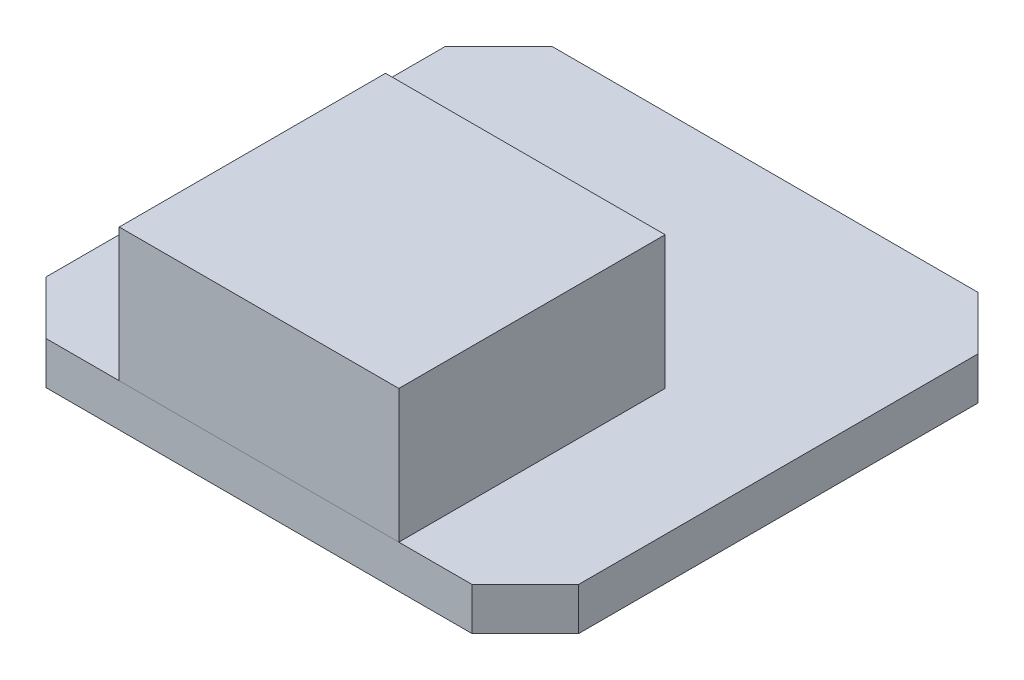
ISO-10303-21;
HEADER;
FILE_DESCRIPTION(('STEP AP214'),'2;1');
FILE_NAME('part.step','',(''),(''),'','','');
FILE_SCHEMA(('AUTOMOTIVE_DESIGN { 1 0 10303 214 1 1 1 1 }'));
ENDSEC;
DATA;
#1=APPLICATION_CONTEXT('core data for automotive mechanical design processes');
#2=APPLICATION_PROTOCOL_DEFINITION('international standard','automotive_design',2000,#1);
#3=PRODUCT_CONTEXT('',#1,'mechanical');
#4=PRODUCT('Part','Part','',(#3));
#5=PRODUCT_RELATED_PRODUCT_CATEGORY('part','',(#4));
#6=PRODUCT_DEFINITION_FORMATION('','',#4);
#7=PRODUCT_DEFINITION_CONTEXT('part definition',#1,'design');
#8=PRODUCT_DEFINITION('design','',#6,#7);
#9=PRODUCT_DEFINITION_SHAPE('','',#8);
#10=(LENGTH_UNIT() NAMED_UNIT(*) SI_UNIT(.MILLI.,.METRE.));
#11=(NAMED_UNIT(*) PLANE_ANGLE_UNIT() SI_UNIT($,.RADIAN.));
#12=(NAMED_UNIT(*) SI_UNIT($,.STERADIAN.) SOLID_ANGLE_UNIT());
#13=UNCERTAINTY_MEASURE_WITH_UNIT(LENGTH_MEASURE(1.E-05),#10,'distance_accuracy_value','');
#14=(GEOMETRIC_REPRESENTATION_CONTEXT(3) GLOBAL_UNCERTAINTY_ASSIGNED_CONTEXT((#13)) GLOBAL_UNIT_ASSIGNED_CONTEXT((#10,
#11,#12)) REPRESENTATION_CONTEXT('',''));
#15=CARTESIAN_POINT('',(0.,0.,0.));
#16=DIRECTION('',(0.,0.,1.));
#17=DIRECTION('',(1.,0.,0.));
#18=AXIS2_PLACEMENT_3D('',#15,#16,#17);
#19=CARTESIAN_POINT('',(4.74999999999999,6.6,0.));
#20=DIRECTION('',(1.,0.,0.));
#21=DIRECTION('',(0.,0.,-1.));
#22=AXIS2_PLACEMENT_3D('',#19,#20,#21);
#23=PLANE('',#22);
#24=DIRECTION('',(0.,0.,1.));
#25=VECTOR('',#24,1.);
#26=CARTESIAN_POINT('',(4.74999999999999,1.6,0.));
#27=LINE('',#26,#25);
#28=CARTESIAN_POINT('',(4.74999999999999,1.6,-10.));
#29=VERTEX_POINT('',#28);
#30=CARTESIAN_POINT('',(4.74999999999999,1.6,0.));
#31=VERTEX_POINT('',#30);
#32=EDGE_CURVE('E106',#29,#31,#27,.T.);
#33=ORIENTED_EDGE('',*,*,#32,.T.);
#34=DIRECTION('',(0.,-1.,0.));
#35=VECTOR('',#34,1.);
#36=CARTESIAN_POINT('',(4.74999999999999,6.6,0.));
#37=LINE('',#36,#35);
#38=CARTESIAN_POINT('',(4.74999999999999,6.6,0.));
#39=VERTEX_POINT('',#38);
#40=EDGE_CURVE('E12',#39,#31,#37,.T.);
#41=ORIENTED_EDGE('',*,*,#40,.F.);
#42=DIRECTION('',(0.,0.,1.));
#43=VECTOR('',#42,1.);
#44=CARTESIAN_POINT('',(4.74999999999999,6.6,0.));
#45=LINE('',#44,#43);
#46=CARTESIAN_POINT('',(4.74999999999999,6.6,-10.));
#47=VERTEX_POINT('',#46);
#48=EDGE_CURVE('E94',#47,#39,#45,.T.);
#49=ORIENTED_EDGE('',*,*,#48,.F.);
#50=DIRECTION('',(0.,-1.,0.));
#51=VECTOR('',#50,1.);
#52=CARTESIAN_POINT('',(4.74999999999999,6.6,-10.));
#53=LINE('',#52,#51);
#54=EDGE_CURVE('E102',#47,#29,#53,.T.);
#55=ORIENTED_EDGE('',*,*,#54,.T.);
#56=EDGE_LOOP('',(#33,#41,#49,#55));
#57=FACE_BOUND('',#56,.T.);
#58=ADVANCED_FACE('F43',(#57),#23,.F.);
#59=CARTESIAN_POINT('',(4.74999999999999,6.6,0.));
#60=DIRECTION('',(0.,0.,-1.));
#61=DIRECTION('',(-1.,0.,0.));
#62=AXIS2_PLACEMENT_3D('',#59,#60,#61);
#63=PLANE('',#62);
#64=DIRECTION('',(1.,0.,0.));
#65=VECTOR('',#64,1.);
#66=CARTESIAN_POINT('',(4.74999999999999,1.6,0.));
#67=LINE('',#66,#65);
#68=CARTESIAN_POINT('',(15.25,1.6,0.));
#69=VERTEX_POINT('',#68);
#70=EDGE_CURVE('E98',#31,#69,#67,.T.);
#71=ORIENTED_EDGE('',*,*,#70,.T.);
#72=DIRECTION('',(0.,-1.,0.));
#73=VECTOR('',#72,1.);
#74=CARTESIAN_POINT('',(15.25,6.6,0.));
#75=LINE('',#74,#73);
#76=CARTESIAN_POINT('',(15.25,6.6,0.));
#77=VERTEX_POINT('',#76);
#78=EDGE_CURVE('E51',#77,#69,#75,.T.);
#79=ORIENTED_EDGE('',*,*,#78,.F.);
#80=DIRECTION('',(1.,0.,0.));
#81=VECTOR('',#80,1.);
#82=CARTESIAN_POINT('',(4.74999999999999,6.6,0.));
#83=LINE('',#82,#81);
#84=EDGE_CURVE('E89',#39,#77,#83,.T.);
#85=ORIENTED_EDGE('',*,*,#84,.F.);
#86=ORIENTED_EDGE('',*,*,#40,.T.);
#87=EDGE_LOOP('',(#71,#79,#85,#86));
#88=FACE_BOUND('',#87,.T.);
#89=ADVANCED_FACE('F97',(#88),#63,.F.);
#90=CARTESIAN_POINT('',(15.25,6.6,0.));
#91=DIRECTION('',(-1.,0.,0.));
#92=DIRECTION('',(0.,0.,1.));
#93=AXIS2_PLACEMENT_3D('',#90,#91,#92);
#94=PLANE('',#93);
#95=DIRECTION('',(0.,0.,-1.));
#96=VECTOR('',#95,1.);
#97=CARTESIAN_POINT('',(15.25,1.6,0.));
#98=LINE('',#97,#96);
#99=CARTESIAN_POINT('',(15.25,1.6,-10.));
#100=VERTEX_POINT('',#99);
#101=EDGE_CURVE('E76',#69,#100,#98,.T.);
#102=ORIENTED_EDGE('',*,*,#101,.T.);
#103=DIRECTION('',(0.,-1.,0.));
#104=VECTOR('',#103,1.);
#105=CARTESIAN_POINT('',(15.25,6.6,-10.));
#106=LINE('',#105,#104);
#107=CARTESIAN_POINT('',(15.25,6.6,-10.));
#108=VERTEX_POINT('',#107);
#109=EDGE_CURVE('E99',#108,#100,#106,.T.);
#110=ORIENTED_EDGE('',*,*,#109,.F.);
#111=DIRECTION('',(0.,0.,-1.));
#112=VECTOR('',#111,1.);
#113=CARTESIAN_POINT('',(15.25,6.6,0.));
#114=LINE('',#113,#112);
#115=EDGE_CURVE('E92',#77,#108,#114,.T.);
#116=ORIENTED_EDGE('',*,*,#115,.F.);
#117=ORIENTED_EDGE('',*,*,#78,.T.);
#118=EDGE_LOOP('',(#102,#110,#116,#117));
#119=FACE_BOUND('',#118,.T.);
#120=ADVANCED_FACE('F100',(#119),#94,.F.);
#121=CARTESIAN_POINT('',(4.74999999999999,6.6,-10.));
#122=DIRECTION('',(0.,0.,1.));
#123=DIRECTION('',(1.,0.,0.));
#124=AXIS2_PLACEMENT_3D('',#121,#122,#123);
#125=PLANE('',#124);
#126=DIRECTION('',(-1.,0.,0.));
#127=VECTOR('',#126,1.);
#128=CARTESIAN_POINT('',(4.74999999999999,1.6,-10.));
#129=LINE('',#128,#127);
#130=EDGE_CURVE('E82',#100,#29,#129,.T.);
#131=ORIENTED_EDGE('',*,*,#130,.T.);
#132=ORIENTED_EDGE('',*,*,#54,.F.);
#133=DIRECTION('',(-1.,0.,0.));
#134=VECTOR('',#133,1.);
#135=CARTESIAN_POINT('',(4.74999999999999,6.6,-10.));
#136=LINE('',#135,#134);
#137=EDGE_CURVE('E59',#108,#47,#136,.T.);
#138=ORIENTED_EDGE('',*,*,#137,.F.);
#139=ORIENTED_EDGE('',*,*,#109,.T.);
#140=EDGE_LOOP('',(#131,#132,#138,#139));
#141=FACE_BOUND('',#140,.T.);
#142=ADVANCED_FACE('F113',(#141),#125,.F.);
#143=CARTESIAN_POINT('',(0.,6.6,0.));
#144=DIRECTION('',(0.,-1.,0.));
#145=DIRECTION('',(0.,0.,-1.));
#146=AXIS2_PLACEMENT_3D('',#143,#144,#145);
#147=PLANE('',#146);
#148=ORIENTED_EDGE('',*,*,#48,.T.);
#149=ORIENTED_EDGE('',*,*,#84,.T.);
#150=ORIENTED_EDGE('',*,*,#115,.T.);
#151=ORIENTED_EDGE('',*,*,#137,.T.);
#152=EDGE_LOOP('',(#148,#149,#150,#151));
#153=FACE_BOUND('',#152,.T.);
#154=ADVANCED_FACE('F90',(#153),#147,.F.);
#155=CARTESIAN_POINT('',(0.,1.6,0.));
#156=DIRECTION('',(0.,-1.,0.));
#157=DIRECTION('',(0.,0.,-1.));
#158=AXIS2_PLACEMENT_3D('',#155,#156,#157);
#159=PLANE('',#158);
#160=ORIENTED_EDGE('',*,*,#32,.F.);
#161=ORIENTED_EDGE('',*,*,#130,.F.);
#162=ORIENTED_EDGE('',*,*,#101,.F.);
#163=ORIENTED_EDGE('',*,*,#70,.F.);
#164=EDGE_LOOP('',(#160,#161,#162,#163));
#165=FACE_BOUND('',#164,.T.);
#166=ADVANCED_FACE('F116',(#165),#159,.T.);
#167=CLOSED_SHELL('',(#58,#89,#120,#142,#154,#166));
#168=MANIFOLD_SOLID_BREP('B2',#167);
#169=CARTESIAN_POINT('',(0.,1.6,0.));
#170=DIRECTION('',(1.,0.,0.));
#171=DIRECTION('',(0.,0.,-1.));
#172=AXIS2_PLACEMENT_3D('',#169,#170,#171);
#173=PLANE('',#172);
#174=DIRECTION('',(0.,0.,1.));
#175=VECTOR('',#174,1.);
#176=CARTESIAN_POINT('',(0.,1.6,0.));
#177=LINE('',#176,#175);
#178=CARTESIAN_POINT('',(0.,1.6,-17.));
#179=VERTEX_POINT('',#178);
#180=CARTESIAN_POINT('',(0.,1.6,-2.00000000000001));
#181=VERTEX_POINT('',#180);
#182=EDGE_CURVE('E253',#179,#181,#177,.T.);
#183=ORIENTED_EDGE('',*,*,#182,.F.);
#184=DIRECTION('',(0.,-1.,0.));
#185=VECTOR('',#184,1.);
#186=CARTESIAN_POINT('',(0.,1.6,-17.));
#187=LINE('',#186,#185);
#188=CARTESIAN_POINT('',(0.,0.,-17.));
#189=VERTEX_POINT('',#188);
#190=EDGE_CURVE('E238',#179,#189,#187,.T.);
#191=ORIENTED_EDGE('',*,*,#190,.T.);
#192=DIRECTION('',(0.,0.,1.));
#193=VECTOR('',#192,1.);
#194=CARTESIAN_POINT('',(0.,0.,0.));
#195=LINE('',#194,#193);
#196=CARTESIAN_POINT('',(0.,0.,-2.00000000000001));
#197=VERTEX_POINT('',#196);
#198=EDGE_CURVE('E250',#189,#197,#195,.T.);
#199=ORIENTED_EDGE('',*,*,#198,.T.);
#200=DIRECTION('',(0.,1.,0.));
#201=VECTOR('',#200,1.);
#202=CARTESIAN_POINT('',(0.,1.6,-2.00000000000001));
#203=LINE('',#202,#201);
#204=EDGE_CURVE('E255',#197,#181,#203,.T.);
#205=ORIENTED_EDGE('',*,*,#204,.T.);
#206=EDGE_LOOP('',(#183,#191,#199,#205));
#207=FACE_BOUND('',#206,.T.);
#208=ADVANCED_FACE('F167',(#207),#173,.F.);
#209=CARTESIAN_POINT('',(0.,1.6,0.));
#210=DIRECTION('',(0.,0.,-1.));
#211=DIRECTION('',(-1.,0.,0.));
#212=AXIS2_PLACEMENT_3D('',#209,#210,#211);
#213=PLANE('',#212);
#214=DIRECTION('',(1.,0.,0.));
#215=VECTOR('',#214,1.);
#216=CARTESIAN_POINT('',(0.,1.6,0.));
#217=LINE('',#216,#215);
#218=CARTESIAN_POINT('',(2.,1.6,0.));
#219=VERTEX_POINT('',#218);
#220=CARTESIAN_POINT('',(18.,1.6,0.));
#221=VERTEX_POINT('',#220);
#222=EDGE_CURVE('E293',#219,#221,#217,.T.);
#223=ORIENTED_EDGE('',*,*,#222,.F.);
#224=DIRECTION('',(0.,-1.,0.));
#225=VECTOR('',#224,1.);
#226=CARTESIAN_POINT('',(2.,1.6,0.));
#227=LINE('',#226,#225);
#228=CARTESIAN_POINT('',(2.,0.,0.));
#229=VERTEX_POINT('',#228);
#230=EDGE_CURVE('E41',#219,#229,#227,.T.);
#231=ORIENTED_EDGE('',*,*,#230,.T.);
#232=DIRECTION('',(1.,0.,0.));
#233=VECTOR('',#232,1.);
#234=CARTESIAN_POINT('',(0.,0.,0.));
#235=LINE('',#234,#233);
#236=CARTESIAN_POINT('',(18.,0.,0.));
#237=VERTEX_POINT('',#236);
#238=EDGE_CURVE('E260',#229,#237,#235,.T.);
#239=ORIENTED_EDGE('',*,*,#238,.T.);
#240=DIRECTION('',(0.,1.,0.));
#241=VECTOR('',#240,1.);
#242=CARTESIAN_POINT('',(18.,1.6,0.));
#243=LINE('',#242,#241);
#244=EDGE_CURVE('E175',#237,#221,#243,.T.);
#245=ORIENTED_EDGE('',*,*,#244,.T.);
#246=EDGE_LOOP('',(#223,#231,#239,#245));
#247=FACE_BOUND('',#246,.T.);
#248=ADVANCED_FACE('F292',(#247),#213,.F.);
#249=CARTESIAN_POINT('',(20.,1.6,0.));
#250=DIRECTION('',(-1.,0.,0.));
#251=DIRECTION('',(0.,0.,1.));
#252=AXIS2_PLACEMENT_3D('',#249,#250,#251);
#253=PLANE('',#252);
#254=DIRECTION('',(0.,0.,-1.));
#255=VECTOR('',#254,1.);
#256=CARTESIAN_POINT('',(20.,0.,0.));
#257=LINE('',#256,#255);
#258=CARTESIAN_POINT('',(20.,0.,-2.));
#259=VERTEX_POINT('',#258);
#260=CARTESIAN_POINT('',(20.,0.,-17.));
#261=VERTEX_POINT('',#260);
#262=EDGE_CURVE('E263',#259,#261,#257,.T.);
#263=ORIENTED_EDGE('',*,*,#262,.T.);
#264=DIRECTION('',(0.,1.,0.));
#265=VECTOR('',#264,1.);
#266=CARTESIAN_POINT('',(20.,1.6,-17.));
#267=LINE('',#266,#265);
#268=CARTESIAN_POINT('',(20.,1.6,-17.));
#269=VERTEX_POINT('',#268);
#270=EDGE_CURVE('E182',#261,#269,#267,.T.);
#271=ORIENTED_EDGE('',*,*,#270,.T.);
#272=DIRECTION('',(0.,0.,-1.));
#273=VECTOR('',#272,1.);
#274=CARTESIAN_POINT('',(20.,1.6,0.));
#275=LINE('',#274,#273);
#276=CARTESIAN_POINT('',(20.,1.6,-2.));
#277=VERTEX_POINT('',#276);
#278=EDGE_CURVE('E299',#277,#269,#275,.T.);
#279=ORIENTED_EDGE('',*,*,#278,.F.);
#280=DIRECTION('',(0.,-1.,0.));
#281=VECTOR('',#280,1.);
#282=CARTESIAN_POINT('',(20.,1.6,-2.));
#283=LINE('',#282,#281);
#284=EDGE_CURVE('E286',#277,#259,#283,.T.);
#285=ORIENTED_EDGE('',*,*,#284,.T.);
#286=EDGE_LOOP('',(#263,#271,#279,#285));
#287=FACE_BOUND('',#286,.T.);
#288=ADVANCED_FACE('F303',(#287),#253,.F.);
#289=CARTESIAN_POINT('',(0.,1.6,-19.));
#290=DIRECTION('',(0.,0.,1.));
#291=DIRECTION('',(1.,0.,0.));
#292=AXIS2_PLACEMENT_3D('',#289,#290,#291);
#293=PLANE('',#292);
#294=DIRECTION('',(-1.,0.,0.));
#295=VECTOR('',#294,1.);
#296=CARTESIAN_POINT('',(0.,0.,-19.));
#297=LINE('',#296,#295);
#298=CARTESIAN_POINT('',(18.,0.,-19.));
#299=VERTEX_POINT('',#298);
#300=CARTESIAN_POINT('',(2.00000000000001,0.,-19.));
#301=VERTEX_POINT('',#300);
#302=EDGE_CURVE('E270',#299,#301,#297,.T.);
#303=ORIENTED_EDGE('',*,*,#302,.T.);
#304=DIRECTION('',(0.,1.,0.));
#305=VECTOR('',#304,1.);
#306=CARTESIAN_POINT('',(2.00000000000001,1.6,-19.));
#307=LINE('',#306,#305);
#308=CARTESIAN_POINT('',(2.00000000000001,1.6,-19.));
#309=VERTEX_POINT('',#308);
#310=EDGE_CURVE('E239',#301,#309,#307,.T.);
#311=ORIENTED_EDGE('',*,*,#310,.T.);
#312=DIRECTION('',(-1.,0.,0.));
#313=VECTOR('',#312,1.);
#314=CARTESIAN_POINT('',(0.,1.6,-19.));
#315=LINE('',#314,#313);
#316=CARTESIAN_POINT('',(18.,1.6,-19.));
#317=VERTEX_POINT('',#316);
#318=EDGE_CURVE('E266',#317,#309,#315,.T.);
#319=ORIENTED_EDGE('',*,*,#318,.F.);
#320=DIRECTION('',(0.,-1.,0.));
#321=VECTOR('',#320,1.);
#322=CARTESIAN_POINT('',(18.,1.6,-19.));
#323=LINE('',#322,#321);
#324=EDGE_CURVE('E244',#317,#299,#323,.T.);
#325=ORIENTED_EDGE('',*,*,#324,.T.);
#326=EDGE_LOOP('',(#303,#311,#319,#325));
#327=FACE_BOUND('',#326,.T.);
#328=ADVANCED_FACE('F310',(#327),#293,.F.);
#329=CARTESIAN_POINT('',(0.,1.6,0.));
#330=DIRECTION('',(0.,-1.,0.));
#331=DIRECTION('',(0.,0.,-1.));
#332=AXIS2_PLACEMENT_3D('',#329,#330,#331);
#333=PLANE('',#332);
#334=ORIENTED_EDGE('',*,*,#318,.T.);
#335=DIRECTION('',(0.707106781186549,0.,-0.707106781186546));
#336=VECTOR('',#335,1.);
#337=CARTESIAN_POINT('',(0.,1.6,-17.));
#338=LINE('',#337,#336);
#339=EDGE_CURVE('E284',#309,#179,#338,.F.);
#340=ORIENTED_EDGE('',*,*,#339,.T.);
#341=ORIENTED_EDGE('',*,*,#182,.T.);
#342=DIRECTION('',(-0.707106781186546,0.,-0.707106781186549));
#343=VECTOR('',#342,1.);
#344=CARTESIAN_POINT('',(2.,1.6,0.));
#345=LINE('',#344,#343);
#346=EDGE_CURVE('E280',#181,#219,#345,.F.);
#347=ORIENTED_EDGE('',*,*,#346,.T.);
#348=ORIENTED_EDGE('',*,*,#222,.T.);
#349=DIRECTION('',(-0.707106781186549,0.,0.707106781186546));
#350=VECTOR('',#349,1.);
#351=CARTESIAN_POINT('',(20.,1.6,-2.));
#352=LINE('',#351,#350);
#353=EDGE_CURVE('E189',#221,#277,#352,.F.);
#354=ORIENTED_EDGE('',*,*,#353,.T.);
#355=ORIENTED_EDGE('',*,*,#278,.T.);
#356=DIRECTION('',(0.707106781186546,0.,0.707106781186549));
#357=VECTOR('',#356,1.);
#358=CARTESIAN_POINT('',(18.,1.6,-19.));
#359=LINE('',#358,#357);
#360=EDGE_CURVE('E282',#269,#317,#359,.F.);
#361=ORIENTED_EDGE('',*,*,#360,.T.);
#362=EDGE_LOOP('',(#334,#340,#341,#347,#348,#354,#355,#361));
#363=FACE_BOUND('',#362,.T.);
#364=ADVANCED_FACE('F297',(#363),#333,.F.);
#365=CARTESIAN_POINT('',(0.,0.,0.));
#366=DIRECTION('',(0.,-1.,0.));
#367=DIRECTION('',(0.,0.,-1.));
#368=AXIS2_PLACEMENT_3D('',#365,#366,#367);
#369=PLANE('',#368);
#370=ORIENTED_EDGE('',*,*,#198,.F.);
#371=DIRECTION('',(-0.707106781186549,0.,0.707106781186546));
#372=VECTOR('',#371,1.);
#373=CARTESIAN_POINT('',(-8.5,0.,-8.50000000000004));
#374=LINE('',#373,#372);
#375=EDGE_CURVE('E234',#189,#301,#374,.F.);
#376=ORIENTED_EDGE('',*,*,#375,.T.);
#377=ORIENTED_EDGE('',*,*,#302,.F.);
#378=DIRECTION('',(-0.707106781186546,0.,-0.707106781186549));
#379=VECTOR('',#378,1.);
#380=CARTESIAN_POINT('',(18.5,0.,-18.5));
#381=LINE('',#380,#379);
#382=EDGE_CURVE('E245',#299,#261,#381,.F.);
#383=ORIENTED_EDGE('',*,*,#382,.T.);
#384=ORIENTED_EDGE('',*,*,#262,.F.);
#385=DIRECTION('',(0.707106781186549,0.,-0.707106781186546));
#386=VECTOR('',#385,1.);
#387=CARTESIAN_POINT('',(8.99999999999995,0.,9.));
#388=LINE('',#387,#386);
#389=EDGE_CURVE('E254',#259,#237,#388,.F.);
#390=ORIENTED_EDGE('',*,*,#389,.T.);
#391=ORIENTED_EDGE('',*,*,#238,.F.);
#392=DIRECTION('',(0.707106781186546,0.,0.707106781186549));
#393=VECTOR('',#392,1.);
#394=CARTESIAN_POINT('',(1.,0.,-0.999999999999999));
#395=LINE('',#394,#393);
#396=EDGE_CURVE('E259',#229,#197,#395,.F.);
#397=ORIENTED_EDGE('',*,*,#396,.T.);
#398=EDGE_LOOP('',(#370,#376,#377,#383,#384,#390,#391,#397));
#399=FACE_BOUND('',#398,.T.);
#400=ADVANCED_FACE('F257',(#399),#369,.T.);
#401=CARTESIAN_POINT('',(0.,1.6,-17.));
#402=DIRECTION('',(0.707106781186546,0.,0.707106781186549));
#403=DIRECTION('',(0.,-1.,0.));
#404=AXIS2_PLACEMENT_3D('',#401,#402,#403);
#405=PLANE('',#404);
#406=ORIENTED_EDGE('',*,*,#339,.F.);
#407=ORIENTED_EDGE('',*,*,#310,.F.);
#408=ORIENTED_EDGE('',*,*,#375,.F.);
#409=ORIENTED_EDGE('',*,*,#190,.F.);
#410=EDGE_LOOP('',(#406,#407,#408,#409));
#411=FACE_BOUND('',#410,.T.);
#412=ADVANCED_FACE('F237',(#411),#405,.F.);
#413=CARTESIAN_POINT('',(18.,1.6,-19.));
#414=DIRECTION('',(-0.707106781186549,0.,0.707106781186546));
#415=DIRECTION('',(0.,-1.,0.));
#416=AXIS2_PLACEMENT_3D('',#413,#414,#415);
#417=PLANE('',#416);
#418=ORIENTED_EDGE('',*,*,#360,.F.);
#419=ORIENTED_EDGE('',*,*,#270,.F.);
#420=ORIENTED_EDGE('',*,*,#382,.F.);
#421=ORIENTED_EDGE('',*,*,#324,.F.);
#422=EDGE_LOOP('',(#418,#419,#420,#421));
#423=FACE_BOUND('',#422,.T.);
#424=ADVANCED_FACE('F307',(#423),#417,.F.);
#425=CARTESIAN_POINT('',(2.,1.6,0.));
#426=DIRECTION('',(0.707106781186549,0.,-0.707106781186546));
#427=DIRECTION('',(0.,-1.,0.));
#428=AXIS2_PLACEMENT_3D('',#425,#426,#427);
#429=PLANE('',#428);
#430=ORIENTED_EDGE('',*,*,#346,.F.);
#431=ORIENTED_EDGE('',*,*,#204,.F.);
#432=ORIENTED_EDGE('',*,*,#396,.F.);
#433=ORIENTED_EDGE('',*,*,#230,.F.);
#434=EDGE_LOOP('',(#430,#431,#432,#433));
#435=FACE_BOUND('',#434,.T.);
#436=ADVANCED_FACE('F313',(#435),#429,.F.);
#437=CARTESIAN_POINT('',(20.,1.6,-2.));
#438=DIRECTION('',(-0.707106781186546,0.,-0.707106781186549));
#439=DIRECTION('',(0.,-1.,0.));
#440=AXIS2_PLACEMENT_3D('',#437,#438,#439);
#441=PLANE('',#440);
#442=ORIENTED_EDGE('',*,*,#353,.F.);
#443=ORIENTED_EDGE('',*,*,#244,.F.);
#444=ORIENTED_EDGE('',*,*,#389,.F.);
#445=ORIENTED_EDGE('',*,*,#284,.F.);
#446=EDGE_LOOP('',(#442,#443,#444,#445));
#447=FACE_BOUND('',#446,.T.);
#448=ADVANCED_FACE('F169',(#447),#441,.F.);
#449=CLOSED_SHELL('',(#208,#248,#288,#328,#364,#400,#412,#424,#436,#448));
#450=MANIFOLD_SOLID_BREP('B6',#449);
#451=ADVANCED_BREP_SHAPE_REPRESENTATION('',(#18,#168,#450),#14);
#452=SHAPE_DEFINITION_REPRESENTATION(#9,#451);
ENDSEC;
END-ISO-10303-21;
